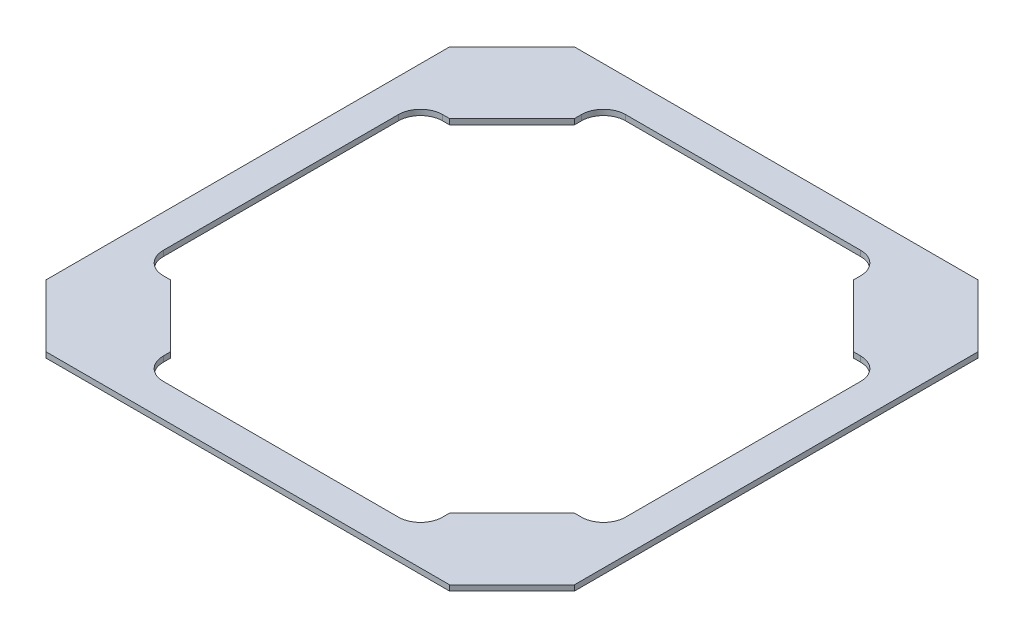
ISO-10303-21;
HEADER;
FILE_DESCRIPTION(('STEP AP214'),'2;1');
FILE_NAME('part.step','',(''),(''),'','','');
FILE_SCHEMA(('AUTOMOTIVE_DESIGN { 1 0 10303 214 1 1 1 1 }'));
ENDSEC;
DATA;
#1=APPLICATION_CONTEXT('core data for automotive mechanical design processes');
#2=APPLICATION_PROTOCOL_DEFINITION('international standard','automotive_design',2000,#1);
#3=PRODUCT_CONTEXT('',#1,'mechanical');
#4=PRODUCT('Part','Part','',(#3));
#5=PRODUCT_RELATED_PRODUCT_CATEGORY('part','',(#4));
#6=PRODUCT_DEFINITION_FORMATION('','',#4);
#7=PRODUCT_DEFINITION_CONTEXT('part definition',#1,'design');
#8=PRODUCT_DEFINITION('design','',#6,#7);
#9=PRODUCT_DEFINITION_SHAPE('','',#8);
#10=(LENGTH_UNIT() NAMED_UNIT(*) SI_UNIT(.MILLI.,.METRE.));
#11=(NAMED_UNIT(*) PLANE_ANGLE_UNIT() SI_UNIT($,.RADIAN.));
#12=(NAMED_UNIT(*) SI_UNIT($,.STERADIAN.) SOLID_ANGLE_UNIT());
#13=UNCERTAINTY_MEASURE_WITH_UNIT(LENGTH_MEASURE(1.E-05),#10,'distance_accuracy_value','');
#14=(GEOMETRIC_REPRESENTATION_CONTEXT(3) GLOBAL_UNCERTAINTY_ASSIGNED_CONTEXT((#13)) GLOBAL_UNIT_ASSIGNED_CONTEXT((#10,
#11,#12)) REPRESENTATION_CONTEXT('',''));
#15=CARTESIAN_POINT('',(0.,0.,0.));
#16=DIRECTION('',(0.,0.,1.));
#17=DIRECTION('',(1.,0.,0.));
#18=AXIS2_PLACEMENT_3D('',#15,#16,#17);
#19=CARTESIAN_POINT('',(0.,3.175,0.));
#20=DIRECTION('',(0.,-1.,0.));
#21=DIRECTION('',(0.,0.,-1.));
#22=AXIS2_PLACEMENT_3D('',#19,#20,#21);
#23=PLANE('',#22);
#24=DIRECTION('',(0.707106781186546,0.,0.707106781186549));
#25=VECTOR('',#24,1.);
#26=CARTESIAN_POINT('',(-152.4,3.175,116.478975515723));
#27=LINE('',#26,#25);
#28=CARTESIAN_POINT('',(-152.4,3.175,116.478975515723));
#29=VERTEX_POINT('',#28);
#30=CARTESIAN_POINT('',(-116.478975515723,3.175,152.4));
#31=VERTEX_POINT('',#30);
#32=EDGE_CURVE('E419',#29,#31,#27,.T.);
#33=ORIENTED_EDGE('',*,*,#32,.T.);
#34=DIRECTION('',(1.,0.,0.));
#35=VECTOR('',#34,1.);
#36=CARTESIAN_POINT('',(-116.478975515723,3.175,152.4));
#37=LINE('',#36,#35);
#38=CARTESIAN_POINT('',(116.478975515723,3.175,152.4));
#39=VERTEX_POINT('',#38);
#40=EDGE_CURVE('E422',#31,#39,#37,.T.);
#41=ORIENTED_EDGE('',*,*,#40,.T.);
#42=DIRECTION('',(0.707106781186546,0.,-0.707106781186549));
#43=VECTOR('',#42,1.);
#44=CARTESIAN_POINT('',(152.4,3.175,116.478975515723));
#45=LINE('',#44,#43);
#46=CARTESIAN_POINT('',(152.4,3.175,116.478975515723));
#47=VERTEX_POINT('',#46);
#48=EDGE_CURVE('E425',#39,#47,#45,.T.);
#49=ORIENTED_EDGE('',*,*,#48,.T.);
#50=DIRECTION('',(0.,0.,-1.));
#51=VECTOR('',#50,1.);
#52=CARTESIAN_POINT('',(152.4,3.175,-116.478975515723));
#53=LINE('',#52,#51);
#54=CARTESIAN_POINT('',(152.4,3.175,-116.478975515723));
#55=VERTEX_POINT('',#54);
#56=EDGE_CURVE('E427',#47,#55,#53,.T.);
#57=ORIENTED_EDGE('',*,*,#56,.T.);
#58=DIRECTION('',(-0.707106781186547,0.,-0.707106781186548));
#59=VECTOR('',#58,1.);
#60=CARTESIAN_POINT('',(152.4,3.175,-116.478975515723));
#61=LINE('',#60,#59);
#62=CARTESIAN_POINT('',(116.478975515723,3.175,-152.4));
#63=VERTEX_POINT('',#62);
#64=EDGE_CURVE('E429',#55,#63,#61,.T.);
#65=ORIENTED_EDGE('',*,*,#64,.T.);
#66=DIRECTION('',(-1.,0.,0.));
#67=VECTOR('',#66,1.);
#68=CARTESIAN_POINT('',(-116.478975515723,3.175,-152.4));
#69=LINE('',#68,#67);
#70=CARTESIAN_POINT('',(-116.478975515723,3.175,-152.4));
#71=VERTEX_POINT('',#70);
#72=EDGE_CURVE('E431',#63,#71,#69,.T.);
#73=ORIENTED_EDGE('',*,*,#72,.T.);
#74=DIRECTION('',(-0.707106781186546,0.,0.707106781186549));
#75=VECTOR('',#74,1.);
#76=CARTESIAN_POINT('',(-152.4,3.175,-116.478975515723));
#77=LINE('',#76,#75);
#78=CARTESIAN_POINT('',(-152.4,3.175,-116.478975515723));
#79=VERTEX_POINT('',#78);
#80=EDGE_CURVE('E433',#71,#79,#77,.T.);
#81=ORIENTED_EDGE('',*,*,#80,.T.);
#82=DIRECTION('',(0.,0.,1.));
#83=VECTOR('',#82,1.);
#84=CARTESIAN_POINT('',(-152.4,3.175,-116.478975515723));
#85=LINE('',#84,#83);
#86=EDGE_CURVE('E435',#79,#29,#85,.T.);
#87=ORIENTED_EDGE('',*,*,#86,.T.);
#88=EDGE_LOOP('',(#33,#41,#49,#57,#65,#73,#81,#87));
#89=FACE_BOUND('',#88,.T.);
#90=DIRECTION('',(-1.,0.,0.));
#91=VECTOR('',#90,1.);
#92=CARTESIAN_POINT('',(-116.478975515723,3.175,-80.5579510314468));
#93=LINE('',#92,#91);
#94=CARTESIAN_POINT('',(-116.478975515723,3.175,-80.5579510314468));
#95=VERTEX_POINT('',#94);
#96=CARTESIAN_POINT('',(-120.65,3.175,-80.5579510314468));
#97=VERTEX_POINT('',#96);
#98=EDGE_CURVE('E242',#95,#97,#93,.T.);
#99=ORIENTED_EDGE('',*,*,#98,.F.);
#100=DIRECTION('',(-0.707106781186547,0.,0.707106781186548));
#101=VECTOR('',#100,1.);
#102=CARTESIAN_POINT('',(-116.478975515723,3.175,-80.5579510314468));
#103=LINE('',#102,#101);
#104=CARTESIAN_POINT('',(-80.5579510314468,3.175,-116.478975515723));
#105=VERTEX_POINT('',#104);
#106=EDGE_CURVE('E307',#105,#95,#103,.T.);
#107=ORIENTED_EDGE('',*,*,#106,.F.);
#108=DIRECTION('',(0.,0.,1.));
#109=VECTOR('',#108,1.);
#110=CARTESIAN_POINT('',(-80.5579510314468,3.175,-116.478975515723));
#111=LINE('',#110,#109);
#112=CARTESIAN_POINT('',(-80.5579510314468,3.175,-120.65));
#113=VERTEX_POINT('',#112);
#114=EDGE_CURVE('E305',#113,#105,#111,.T.);
#115=ORIENTED_EDGE('',*,*,#114,.F.);
#116=CARTESIAN_POINT('',(-67.8579510314468,3.175,-120.65));
#117=DIRECTION('',(0.,1.,0.));
#118=DIRECTION('',(0.,0.,-1.));
#119=AXIS2_PLACEMENT_3D('',#116,#117,#118);
#120=CIRCLE('',#119,12.7);
#121=CARTESIAN_POINT('',(-67.8579510314468,3.175,-133.35));
#122=VERTEX_POINT('',#121);
#123=EDGE_CURVE('E303',#122,#113,#120,.T.);
#124=ORIENTED_EDGE('',*,*,#123,.F.);
#125=DIRECTION('',(-1.,0.,0.));
#126=VECTOR('',#125,1.);
#127=CARTESIAN_POINT('',(-67.8579510314467,3.175,-133.35));
#128=LINE('',#127,#126);
#129=CARTESIAN_POINT('',(67.8579510314467,3.175,-133.35));
#130=VERTEX_POINT('',#129);
#131=EDGE_CURVE('E301',#130,#122,#128,.T.);
#132=ORIENTED_EDGE('',*,*,#131,.F.);
#133=CARTESIAN_POINT('',(67.8579510314468,3.175,-120.65));
#134=DIRECTION('',(0.,1.,0.));
#135=DIRECTION('',(0.,0.,1.));
#136=AXIS2_PLACEMENT_3D('',#133,#134,#135);
#137=CIRCLE('',#136,12.7);
#138=CARTESIAN_POINT('',(80.5579510314468,3.175,-120.65));
#139=VERTEX_POINT('',#138);
#140=EDGE_CURVE('E299',#139,#130,#137,.T.);
#141=ORIENTED_EDGE('',*,*,#140,.F.);
#142=DIRECTION('',(0.,0.,-1.));
#143=VECTOR('',#142,1.);
#144=CARTESIAN_POINT('',(80.5579510314468,3.175,-116.478975515723));
#145=LINE('',#144,#143);
#146=CARTESIAN_POINT('',(80.5579510314468,3.175,-116.478975515723));
#147=VERTEX_POINT('',#146);
#148=EDGE_CURVE('E297',#147,#139,#145,.T.);
#149=ORIENTED_EDGE('',*,*,#148,.F.);
#150=DIRECTION('',(-0.707106781186547,0.,-0.707106781186548));
#151=VECTOR('',#150,1.);
#152=CARTESIAN_POINT('',(116.478975515723,3.175,-80.5579510314467));
#153=LINE('',#152,#151);
#154=CARTESIAN_POINT('',(116.478975515723,3.175,-80.5579510314467));
#155=VERTEX_POINT('',#154);
#156=EDGE_CURVE('E295',#155,#147,#153,.T.);
#157=ORIENTED_EDGE('',*,*,#156,.F.);
#158=DIRECTION('',(-1.,0.,0.));
#159=VECTOR('',#158,1.);
#160=CARTESIAN_POINT('',(116.478975515723,3.175,-80.5579510314467));
#161=LINE('',#160,#159);
#162=CARTESIAN_POINT('',(120.65,3.175,-80.5579510314467));
#163=VERTEX_POINT('',#162);
#164=EDGE_CURVE('E293',#163,#155,#161,.T.);
#165=ORIENTED_EDGE('',*,*,#164,.F.);
#166=CARTESIAN_POINT('',(120.65,3.175,-67.8579510314467));
#167=DIRECTION('',(0.,1.,0.));
#168=DIRECTION('',(0.,0.,-1.));
#169=AXIS2_PLACEMENT_3D('',#166,#167,#168);
#170=CIRCLE('',#169,12.7);
#171=CARTESIAN_POINT('',(133.35,3.175,-67.8579510314466));
#172=VERTEX_POINT('',#171);
#173=EDGE_CURVE('E291',#172,#163,#170,.T.);
#174=ORIENTED_EDGE('',*,*,#173,.F.);
#175=DIRECTION('',(0.,0.,-1.));
#176=VECTOR('',#175,1.);
#177=CARTESIAN_POINT('',(133.35,3.175,-67.8579510314466));
#178=LINE('',#177,#176);
#179=CARTESIAN_POINT('',(133.35,3.175,67.8579510314466));
#180=VERTEX_POINT('',#179);
#181=EDGE_CURVE('E289',#180,#172,#178,.T.);
#182=ORIENTED_EDGE('',*,*,#181,.F.);
#183=CARTESIAN_POINT('',(120.65,3.175,67.8579510314467));
#184=DIRECTION('',(0.,1.,0.));
#185=DIRECTION('',(0.,0.,1.));
#186=AXIS2_PLACEMENT_3D('',#183,#184,#185);
#187=CIRCLE('',#186,12.7);
#188=CARTESIAN_POINT('',(120.65,3.175,80.5579510314467));
#189=VERTEX_POINT('',#188);
#190=EDGE_CURVE('E287',#189,#180,#187,.T.);
#191=ORIENTED_EDGE('',*,*,#190,.F.);
#192=DIRECTION('',(1.,0.,0.));
#193=VECTOR('',#192,1.);
#194=CARTESIAN_POINT('',(116.478975515723,3.175,80.5579510314467));
#195=LINE('',#194,#193);
#196=CARTESIAN_POINT('',(116.478975515723,3.175,80.5579510314467));
#197=VERTEX_POINT('',#196);
#198=EDGE_CURVE('E285',#197,#189,#195,.T.);
#199=ORIENTED_EDGE('',*,*,#198,.F.);
#200=DIRECTION('',(0.707106781186547,0.,-0.707106781186548));
#201=VECTOR('',#200,1.);
#202=CARTESIAN_POINT('',(116.478975515723,3.175,80.5579510314467));
#203=LINE('',#202,#201);
#204=CARTESIAN_POINT('',(80.5579510314468,3.175,116.478975515723));
#205=VERTEX_POINT('',#204);
#206=EDGE_CURVE('E283',#205,#197,#203,.T.);
#207=ORIENTED_EDGE('',*,*,#206,.F.);
#208=DIRECTION('',(0.,0.,-1.));
#209=VECTOR('',#208,1.);
#210=CARTESIAN_POINT('',(80.5579510314468,3.175,116.478975515723));
#211=LINE('',#210,#209);
#212=CARTESIAN_POINT('',(80.5579510314468,3.175,120.65));
#213=VERTEX_POINT('',#212);
#214=EDGE_CURVE('E281',#213,#205,#211,.T.);
#215=ORIENTED_EDGE('',*,*,#214,.F.);
#216=CARTESIAN_POINT('',(67.8579510314468,3.175,120.65));
#217=DIRECTION('',(0.,1.,0.));
#218=DIRECTION('',(0.,0.,-1.));
#219=AXIS2_PLACEMENT_3D('',#216,#217,#218);
#220=CIRCLE('',#219,12.7);
#221=CARTESIAN_POINT('',(67.8579510314467,3.175,133.35));
#222=VERTEX_POINT('',#221);
#223=EDGE_CURVE('E279',#222,#213,#220,.T.);
#224=ORIENTED_EDGE('',*,*,#223,.F.);
#225=DIRECTION('',(1.,0.,0.));
#226=VECTOR('',#225,1.);
#227=CARTESIAN_POINT('',(-67.8579510314467,3.175,133.35));
#228=LINE('',#227,#226);
#229=CARTESIAN_POINT('',(-67.8579510314467,3.175,133.35));
#230=VERTEX_POINT('',#229);
#231=EDGE_CURVE('E277',#230,#222,#228,.T.);
#232=ORIENTED_EDGE('',*,*,#231,.F.);
#233=CARTESIAN_POINT('',(-67.8579510314468,3.175,120.65));
#234=DIRECTION('',(0.,1.,0.));
#235=DIRECTION('',(0.,0.,1.));
#236=AXIS2_PLACEMENT_3D('',#233,#234,#235);
#237=CIRCLE('',#236,12.7);
#238=CARTESIAN_POINT('',(-80.5579510314468,3.175,120.65));
#239=VERTEX_POINT('',#238);
#240=EDGE_CURVE('E275',#239,#230,#237,.T.);
#241=ORIENTED_EDGE('',*,*,#240,.F.);
#242=DIRECTION('',(0.,0.,1.));
#243=VECTOR('',#242,1.);
#244=CARTESIAN_POINT('',(-80.5579510314468,3.175,116.478975515723));
#245=LINE('',#244,#243);
#246=CARTESIAN_POINT('',(-80.5579510314468,3.175,116.478975515723));
#247=VERTEX_POINT('',#246);
#248=EDGE_CURVE('E273',#247,#239,#245,.T.);
#249=ORIENTED_EDGE('',*,*,#248,.F.);
#250=DIRECTION('',(0.707106781186547,0.,0.707106781186548));
#251=VECTOR('',#250,1.);
#252=CARTESIAN_POINT('',(-116.478975515723,3.175,80.5579510314468));
#253=LINE('',#252,#251);
#254=CARTESIAN_POINT('',(-116.478975515723,3.175,80.5579510314468));
#255=VERTEX_POINT('',#254);
#256=EDGE_CURVE('E271',#255,#247,#253,.T.);
#257=ORIENTED_EDGE('',*,*,#256,.F.);
#258=DIRECTION('',(1.,0.,0.));
#259=VECTOR('',#258,1.);
#260=CARTESIAN_POINT('',(-116.478975515723,3.175,80.5579510314468));
#261=LINE('',#260,#259);
#262=CARTESIAN_POINT('',(-120.65,3.175,80.5579510314468));
#263=VERTEX_POINT('',#262);
#264=EDGE_CURVE('E269',#263,#255,#261,.T.);
#265=ORIENTED_EDGE('',*,*,#264,.F.);
#266=CARTESIAN_POINT('',(-120.65,3.175,67.8579510314468));
#267=DIRECTION('',(0.,1.,0.));
#268=DIRECTION('',(0.,0.,-1.));
#269=AXIS2_PLACEMENT_3D('',#266,#267,#268);
#270=CIRCLE('',#269,12.7);
#271=CARTESIAN_POINT('',(-133.35,3.175,67.8579510314467));
#272=VERTEX_POINT('',#271);
#273=EDGE_CURVE('E265',#272,#263,#270,.T.);
#274=ORIENTED_EDGE('',*,*,#273,.F.);
#275=DIRECTION('',(0.,0.,1.));
#276=VECTOR('',#275,1.);
#277=CARTESIAN_POINT('',(-133.35,3.175,-67.8579510314467));
#278=LINE('',#277,#276);
#279=CARTESIAN_POINT('',(-133.35,3.175,-67.8579510314467));
#280=VERTEX_POINT('',#279);
#281=EDGE_CURVE('E263',#280,#272,#278,.T.);
#282=ORIENTED_EDGE('',*,*,#281,.F.);
#283=CARTESIAN_POINT('',(-120.65,3.175,-67.8579510314468));
#284=DIRECTION('',(0.,1.,0.));
#285=DIRECTION('',(0.,0.,1.));
#286=AXIS2_PLACEMENT_3D('',#283,#284,#285);
#287=CIRCLE('',#286,12.7);
#288=EDGE_CURVE('E250',#97,#280,#287,.T.);
#289=ORIENTED_EDGE('',*,*,#288,.F.);
#290=EDGE_LOOP('',(#99,#107,#115,#124,#132,#141,#149,#157,#165,#174,#182,#191,#199,#207,#215,
#224,#232,#241,#249,#257,#265,#274,#282,#289));
#291=FACE_BOUND('',#290,.T.);
#292=ADVANCED_FACE('F33',(#89,#291),#23,.F.);
#293=CARTESIAN_POINT('',(0.,0.,0.));
#294=DIRECTION('',(0.,-1.,0.));
#295=DIRECTION('',(0.,0.,-1.));
#296=AXIS2_PLACEMENT_3D('',#293,#294,#295);
#297=PLANE('',#296);
#298=DIRECTION('',(0.707106781186546,0.,0.707106781186549));
#299=VECTOR('',#298,1.);
#300=CARTESIAN_POINT('',(-152.4,0.,116.478975515723));
#301=LINE('',#300,#299);
#302=CARTESIAN_POINT('',(-152.4,0.,116.478975515723));
#303=VERTEX_POINT('',#302);
#304=CARTESIAN_POINT('',(-116.478975515723,0.,152.4));
#305=VERTEX_POINT('',#304);
#306=EDGE_CURVE('E258',#303,#305,#301,.T.);
#307=ORIENTED_EDGE('',*,*,#306,.F.);
#308=DIRECTION('',(0.,0.,1.));
#309=VECTOR('',#308,1.);
#310=CARTESIAN_POINT('',(-152.4,0.,-116.478975515723));
#311=LINE('',#310,#309);
#312=CARTESIAN_POINT('',(-152.4,0.,-116.478975515723));
#313=VERTEX_POINT('',#312);
#314=EDGE_CURVE('E423',#313,#303,#311,.T.);
#315=ORIENTED_EDGE('',*,*,#314,.F.);
#316=DIRECTION('',(-0.707106781186546,0.,0.707106781186549));
#317=VECTOR('',#316,1.);
#318=CARTESIAN_POINT('',(-152.4,0.,-116.478975515723));
#319=LINE('',#318,#317);
#320=CARTESIAN_POINT('',(-116.478975515723,0.,-152.4));
#321=VERTEX_POINT('',#320);
#322=EDGE_CURVE('E450',#321,#313,#319,.T.);
#323=ORIENTED_EDGE('',*,*,#322,.F.);
#324=DIRECTION('',(-1.,0.,0.));
#325=VECTOR('',#324,1.);
#326=CARTESIAN_POINT('',(-116.478975515723,0.,-152.4));
#327=LINE('',#326,#325);
#328=CARTESIAN_POINT('',(116.478975515723,0.,-152.4));
#329=VERTEX_POINT('',#328);
#330=EDGE_CURVE('E448',#329,#321,#327,.T.);
#331=ORIENTED_EDGE('',*,*,#330,.F.);
#332=DIRECTION('',(-0.707106781186547,0.,-0.707106781186548));
#333=VECTOR('',#332,1.);
#334=CARTESIAN_POINT('',(152.4,0.,-116.478975515723));
#335=LINE('',#334,#333);
#336=CARTESIAN_POINT('',(152.4,0.,-116.478975515723));
#337=VERTEX_POINT('',#336);
#338=EDGE_CURVE('E446',#337,#329,#335,.T.);
#339=ORIENTED_EDGE('',*,*,#338,.F.);
#340=DIRECTION('',(0.,0.,-1.));
#341=VECTOR('',#340,1.);
#342=CARTESIAN_POINT('',(152.4,0.,-116.478975515723));
#343=LINE('',#342,#341);
#344=CARTESIAN_POINT('',(152.4,0.,116.478975515723));
#345=VERTEX_POINT('',#344);
#346=EDGE_CURVE('E444',#345,#337,#343,.T.);
#347=ORIENTED_EDGE('',*,*,#346,.F.);
#348=DIRECTION('',(0.707106781186546,0.,-0.707106781186549));
#349=VECTOR('',#348,1.);
#350=CARTESIAN_POINT('',(152.4,0.,116.478975515723));
#351=LINE('',#350,#349);
#352=CARTESIAN_POINT('',(116.478975515723,0.,152.4));
#353=VERTEX_POINT('',#352);
#354=EDGE_CURVE('E442',#353,#345,#351,.T.);
#355=ORIENTED_EDGE('',*,*,#354,.F.);
#356=DIRECTION('',(1.,0.,0.));
#357=VECTOR('',#356,1.);
#358=CARTESIAN_POINT('',(-116.478975515723,0.,152.4));
#359=LINE('',#358,#357);
#360=EDGE_CURVE('E440',#305,#353,#359,.T.);
#361=ORIENTED_EDGE('',*,*,#360,.F.);
#362=EDGE_LOOP('',(#307,#315,#323,#331,#339,#347,#355,#361));
#363=FACE_BOUND('',#362,.T.);
#364=DIRECTION('',(-0.707106781186547,0.,0.707106781186548));
#365=VECTOR('',#364,1.);
#366=CARTESIAN_POINT('',(-116.478975515723,0.,-80.5579510314468));
#367=LINE('',#366,#365);
#368=CARTESIAN_POINT('',(-80.5579510314468,0.,-116.478975515723));
#369=VERTEX_POINT('',#368);
#370=CARTESIAN_POINT('',(-116.478975515723,0.,-80.5579510314468));
#371=VERTEX_POINT('',#370);
#372=EDGE_CURVE('E251',#369,#371,#367,.T.);
#373=ORIENTED_EDGE('',*,*,#372,.T.);
#374=DIRECTION('',(-1.,0.,0.));
#375=VECTOR('',#374,1.);
#376=CARTESIAN_POINT('',(-116.478975515723,0.,-80.5579510314468));
#377=LINE('',#376,#375);
#378=CARTESIAN_POINT('',(-120.65,0.,-80.5579510314468));
#379=VERTEX_POINT('',#378);
#380=EDGE_CURVE('E56',#371,#379,#377,.T.);
#381=ORIENTED_EDGE('',*,*,#380,.T.);
#382=CARTESIAN_POINT('',(-120.65,0.,-67.8579510314468));
#383=DIRECTION('',(0.,1.,0.));
#384=DIRECTION('',(0.,0.,1.));
#385=AXIS2_PLACEMENT_3D('',#382,#383,#384);
#386=CIRCLE('',#385,12.7);
#387=CARTESIAN_POINT('',(-133.35,0.,-67.8579510314467));
#388=VERTEX_POINT('',#387);
#389=EDGE_CURVE('E257',#379,#388,#386,.T.);
#390=ORIENTED_EDGE('',*,*,#389,.T.);
#391=DIRECTION('',(0.,0.,1.));
#392=VECTOR('',#391,1.);
#393=CARTESIAN_POINT('',(-133.35,0.,-67.8579510314467));
#394=LINE('',#393,#392);
#395=CARTESIAN_POINT('',(-133.35,0.,67.8579510314467));
#396=VERTEX_POINT('',#395);
#397=EDGE_CURVE('E311',#388,#396,#394,.T.);
#398=ORIENTED_EDGE('',*,*,#397,.T.);
#399=CARTESIAN_POINT('',(-120.65,0.,67.8579510314468));
#400=DIRECTION('',(0.,1.,0.));
#401=DIRECTION('',(0.,0.,-1.));
#402=AXIS2_PLACEMENT_3D('',#399,#400,#401);
#403=CIRCLE('',#402,12.7);
#404=CARTESIAN_POINT('',(-120.65,0.,80.5579510314468));
#405=VERTEX_POINT('',#404);
#406=EDGE_CURVE('E314',#396,#405,#403,.T.);
#407=ORIENTED_EDGE('',*,*,#406,.T.);
#408=DIRECTION('',(1.,0.,0.));
#409=VECTOR('',#408,1.);
#410=CARTESIAN_POINT('',(-116.478975515723,0.,80.5579510314468));
#411=LINE('',#410,#409);
#412=CARTESIAN_POINT('',(-116.478975515723,0.,80.5579510314468));
#413=VERTEX_POINT('',#412);
#414=EDGE_CURVE('E317',#405,#413,#411,.T.);
#415=ORIENTED_EDGE('',*,*,#414,.T.);
#416=DIRECTION('',(0.707106781186547,0.,0.707106781186548));
#417=VECTOR('',#416,1.);
#418=CARTESIAN_POINT('',(-116.478975515723,0.,80.5579510314468));
#419=LINE('',#418,#417);
#420=CARTESIAN_POINT('',(-80.5579510314468,0.,116.478975515723));
#421=VERTEX_POINT('',#420);
#422=EDGE_CURVE('E320',#413,#421,#419,.T.);
#423=ORIENTED_EDGE('',*,*,#422,.T.);
#424=DIRECTION('',(0.,0.,1.));
#425=VECTOR('',#424,1.);
#426=CARTESIAN_POINT('',(-80.5579510314468,0.,116.478975515723));
#427=LINE('',#426,#425);
#428=CARTESIAN_POINT('',(-80.5579510314468,0.,120.65));
#429=VERTEX_POINT('',#428);
#430=EDGE_CURVE('E323',#421,#429,#427,.T.);
#431=ORIENTED_EDGE('',*,*,#430,.T.);
#432=CARTESIAN_POINT('',(-67.8579510314468,0.,120.65));
#433=DIRECTION('',(0.,1.,0.));
#434=DIRECTION('',(0.,0.,1.));
#435=AXIS2_PLACEMENT_3D('',#432,#433,#434);
#436=CIRCLE('',#435,12.7);
#437=CARTESIAN_POINT('',(-67.8579510314467,0.,133.35));
#438=VERTEX_POINT('',#437);
#439=EDGE_CURVE('E326',#429,#438,#436,.T.);
#440=ORIENTED_EDGE('',*,*,#439,.T.);
#441=DIRECTION('',(1.,0.,0.));
#442=VECTOR('',#441,1.);
#443=CARTESIAN_POINT('',(-67.8579510314467,0.,133.35));
#444=LINE('',#443,#442);
#445=CARTESIAN_POINT('',(67.8579510314467,0.,133.35));
#446=VERTEX_POINT('',#445);
#447=EDGE_CURVE('E329',#438,#446,#444,.T.);
#448=ORIENTED_EDGE('',*,*,#447,.T.);
#449=CARTESIAN_POINT('',(67.8579510314468,0.,120.65));
#450=DIRECTION('',(0.,1.,0.));
#451=DIRECTION('',(0.,0.,-1.));
#452=AXIS2_PLACEMENT_3D('',#449,#450,#451);
#453=CIRCLE('',#452,12.7);
#454=CARTESIAN_POINT('',(80.5579510314468,0.,120.65));
#455=VERTEX_POINT('',#454);
#456=EDGE_CURVE('E332',#446,#455,#453,.T.);
#457=ORIENTED_EDGE('',*,*,#456,.T.);
#458=DIRECTION('',(0.,0.,-1.));
#459=VECTOR('',#458,1.);
#460=CARTESIAN_POINT('',(80.5579510314468,0.,116.478975515723));
#461=LINE('',#460,#459);
#462=CARTESIAN_POINT('',(80.5579510314468,0.,116.478975515723));
#463=VERTEX_POINT('',#462);
#464=EDGE_CURVE('E335',#455,#463,#461,.T.);
#465=ORIENTED_EDGE('',*,*,#464,.T.);
#466=DIRECTION('',(0.707106781186547,0.,-0.707106781186548));
#467=VECTOR('',#466,1.);
#468=CARTESIAN_POINT('',(116.478975515723,0.,80.5579510314467));
#469=LINE('',#468,#467);
#470=CARTESIAN_POINT('',(116.478975515723,0.,80.5579510314467));
#471=VERTEX_POINT('',#470);
#472=EDGE_CURVE('E338',#463,#471,#469,.T.);
#473=ORIENTED_EDGE('',*,*,#472,.T.);
#474=DIRECTION('',(1.,0.,0.));
#475=VECTOR('',#474,1.);
#476=CARTESIAN_POINT('',(116.478975515723,0.,80.5579510314467));
#477=LINE('',#476,#475);
#478=CARTESIAN_POINT('',(120.65,0.,80.5579510314467));
#479=VERTEX_POINT('',#478);
#480=EDGE_CURVE('E341',#471,#479,#477,.T.);
#481=ORIENTED_EDGE('',*,*,#480,.T.);
#482=CARTESIAN_POINT('',(120.65,0.,67.8579510314467));
#483=DIRECTION('',(0.,1.,0.));
#484=DIRECTION('',(0.,0.,1.));
#485=AXIS2_PLACEMENT_3D('',#482,#483,#484);
#486=CIRCLE('',#485,12.7);
#487=CARTESIAN_POINT('',(133.35,0.,67.8579510314466));
#488=VERTEX_POINT('',#487);
#489=EDGE_CURVE('E344',#479,#488,#486,.T.);
#490=ORIENTED_EDGE('',*,*,#489,.T.);
#491=DIRECTION('',(0.,0.,-1.));
#492=VECTOR('',#491,1.);
#493=CARTESIAN_POINT('',(133.35,0.,-67.8579510314466));
#494=LINE('',#493,#492);
#495=CARTESIAN_POINT('',(133.35,0.,-67.8579510314466));
#496=VERTEX_POINT('',#495);
#497=EDGE_CURVE('E347',#488,#496,#494,.T.);
#498=ORIENTED_EDGE('',*,*,#497,.T.);
#499=CARTESIAN_POINT('',(120.65,0.,-67.8579510314467));
#500=DIRECTION('',(0.,1.,0.));
#501=DIRECTION('',(0.,0.,-1.));
#502=AXIS2_PLACEMENT_3D('',#499,#500,#501);
#503=CIRCLE('',#502,12.7);
#504=CARTESIAN_POINT('',(120.65,0.,-80.5579510314467));
#505=VERTEX_POINT('',#504);
#506=EDGE_CURVE('E350',#496,#505,#503,.T.);
#507=ORIENTED_EDGE('',*,*,#506,.T.);
#508=DIRECTION('',(-1.,0.,0.));
#509=VECTOR('',#508,1.);
#510=CARTESIAN_POINT('',(116.478975515723,0.,-80.5579510314467));
#511=LINE('',#510,#509);
#512=CARTESIAN_POINT('',(116.478975515723,0.,-80.5579510314467));
#513=VERTEX_POINT('',#512);
#514=EDGE_CURVE('E353',#505,#513,#511,.T.);
#515=ORIENTED_EDGE('',*,*,#514,.T.);
#516=DIRECTION('',(-0.707106781186547,0.,-0.707106781186548));
#517=VECTOR('',#516,1.);
#518=CARTESIAN_POINT('',(116.478975515723,0.,-80.5579510314467));
#519=LINE('',#518,#517);
#520=CARTESIAN_POINT('',(80.5579510314468,0.,-116.478975515723));
#521=VERTEX_POINT('',#520);
#522=EDGE_CURVE('E356',#513,#521,#519,.T.);
#523=ORIENTED_EDGE('',*,*,#522,.T.);
#524=DIRECTION('',(0.,0.,-1.));
#525=VECTOR('',#524,1.);
#526=CARTESIAN_POINT('',(80.5579510314468,0.,-116.478975515723));
#527=LINE('',#526,#525);
#528=CARTESIAN_POINT('',(80.5579510314468,0.,-120.65));
#529=VERTEX_POINT('',#528);
#530=EDGE_CURVE('E359',#521,#529,#527,.T.);
#531=ORIENTED_EDGE('',*,*,#530,.T.);
#532=CARTESIAN_POINT('',(67.8579510314468,0.,-120.65));
#533=DIRECTION('',(0.,1.,0.));
#534=DIRECTION('',(0.,0.,1.));
#535=AXIS2_PLACEMENT_3D('',#532,#533,#534);
#536=CIRCLE('',#535,12.7);
#537=CARTESIAN_POINT('',(67.8579510314467,0.,-133.35));
#538=VERTEX_POINT('',#537);
#539=EDGE_CURVE('E362',#529,#538,#536,.T.);
#540=ORIENTED_EDGE('',*,*,#539,.T.);
#541=DIRECTION('',(-1.,0.,0.));
#542=VECTOR('',#541,1.);
#543=CARTESIAN_POINT('',(-67.8579510314467,0.,-133.35));
#544=LINE('',#543,#542);
#545=CARTESIAN_POINT('',(-67.8579510314468,0.,-133.35));
#546=VERTEX_POINT('',#545);
#547=EDGE_CURVE('E365',#538,#546,#544,.T.);
#548=ORIENTED_EDGE('',*,*,#547,.T.);
#549=CARTESIAN_POINT('',(-67.8579510314468,0.,-120.65));
#550=DIRECTION('',(0.,1.,0.));
#551=DIRECTION('',(0.,0.,-1.));
#552=AXIS2_PLACEMENT_3D('',#549,#550,#551);
#553=CIRCLE('',#552,12.7);
#554=CARTESIAN_POINT('',(-80.5579510314468,0.,-120.65));
#555=VERTEX_POINT('',#554);
#556=EDGE_CURVE('E368',#546,#555,#553,.T.);
#557=ORIENTED_EDGE('',*,*,#556,.T.);
#558=DIRECTION('',(0.,0.,1.));
#559=VECTOR('',#558,1.);
#560=CARTESIAN_POINT('',(-80.5579510314468,0.,-116.478975515723));
#561=LINE('',#560,#559);
#562=EDGE_CURVE('E371',#555,#369,#561,.T.);
#563=ORIENTED_EDGE('',*,*,#562,.T.);
#564=EDGE_LOOP('',(#373,#381,#390,#398,#407,#415,#423,#431,#440,#448,#457,#465,#473,#481,#490,
#498,#507,#515,#523,#531,#540,#548,#557,#563));
#565=FACE_BOUND('',#564,.T.);
#566=ADVANCED_FACE('F480',(#363,#565),#297,.T.);
#567=CARTESIAN_POINT('',(-152.4,3.175,116.478975515723));
#568=DIRECTION('',(0.707106781186549,0.,-0.707106781186546));
#569=DIRECTION('',(-0.707106781186546,0.,-0.707106781186549));
#570=AXIS2_PLACEMENT_3D('',#567,#568,#569);
#571=PLANE('',#570);
#572=ORIENTED_EDGE('',*,*,#306,.T.);
#573=DIRECTION('',(0.,-1.,0.));
#574=VECTOR('',#573,1.);
#575=CARTESIAN_POINT('',(-116.478975515723,3.175,152.4));
#576=LINE('',#575,#574);
#577=EDGE_CURVE('E11',#31,#305,#576,.T.);
#578=ORIENTED_EDGE('',*,*,#577,.F.);
#579=ORIENTED_EDGE('',*,*,#32,.F.);
#580=DIRECTION('',(0.,-1.,0.));
#581=VECTOR('',#580,1.);
#582=CARTESIAN_POINT('',(-152.4,3.175,116.478975515723));
#583=LINE('',#582,#581);
#584=EDGE_CURVE('E437',#29,#303,#583,.T.);
#585=ORIENTED_EDGE('',*,*,#584,.T.);
#586=EDGE_LOOP('',(#572,#578,#579,#585));
#587=FACE_BOUND('',#586,.T.);
#588=ADVANCED_FACE('F35',(#587),#571,.F.);
#589=CARTESIAN_POINT('',(-116.478975515723,3.175,152.4));
#590=DIRECTION('',(0.,0.,-1.));
#591=DIRECTION('',(-1.,0.,0.));
#592=AXIS2_PLACEMENT_3D('',#589,#590,#591);
#593=PLANE('',#592);
#594=ORIENTED_EDGE('',*,*,#360,.T.);
#595=DIRECTION('',(0.,-1.,0.));
#596=VECTOR('',#595,1.);
#597=CARTESIAN_POINT('',(116.478975515723,3.175,152.4));
#598=LINE('',#597,#596);
#599=EDGE_CURVE('E41',#39,#353,#598,.T.);
#600=ORIENTED_EDGE('',*,*,#599,.F.);
#601=ORIENTED_EDGE('',*,*,#40,.F.);
#602=ORIENTED_EDGE('',*,*,#577,.T.);
#603=EDGE_LOOP('',(#594,#600,#601,#602));
#604=FACE_BOUND('',#603,.T.);
#605=ADVANCED_FACE('F497',(#604),#593,.F.);
#606=CARTESIAN_POINT('',(152.4,3.175,116.478975515723));
#607=DIRECTION('',(-0.707106781186549,0.,-0.707106781186546));
#608=DIRECTION('',(-0.707106781186546,0.,0.707106781186549));
#609=AXIS2_PLACEMENT_3D('',#606,#607,#608);
#610=PLANE('',#609);
#611=ORIENTED_EDGE('',*,*,#354,.T.);
#612=DIRECTION('',(0.,-1.,0.));
#613=VECTOR('',#612,1.);
#614=CARTESIAN_POINT('',(152.4,3.175,116.478975515723));
#615=LINE('',#614,#613);
#616=EDGE_CURVE('E467',#47,#345,#615,.T.);
#617=ORIENTED_EDGE('',*,*,#616,.F.);
#618=ORIENTED_EDGE('',*,*,#48,.F.);
#619=ORIENTED_EDGE('',*,*,#599,.T.);
#620=EDGE_LOOP('',(#611,#617,#618,#619));
#621=FACE_BOUND('',#620,.T.);
#622=ADVANCED_FACE('F474',(#621),#610,.F.);
#623=CARTESIAN_POINT('',(152.4,3.175,-116.478975515723));
#624=DIRECTION('',(-1.,0.,0.));
#625=DIRECTION('',(0.,0.,1.));
#626=AXIS2_PLACEMENT_3D('',#623,#624,#625);
#627=PLANE('',#626);
#628=ORIENTED_EDGE('',*,*,#346,.T.);
#629=DIRECTION('',(0.,-1.,0.));
#630=VECTOR('',#629,1.);
#631=CARTESIAN_POINT('',(152.4,3.175,-116.478975515723));
#632=LINE('',#631,#630);
#633=EDGE_CURVE('E464',#55,#337,#632,.T.);
#634=ORIENTED_EDGE('',*,*,#633,.F.);
#635=ORIENTED_EDGE('',*,*,#56,.F.);
#636=ORIENTED_EDGE('',*,*,#616,.T.);
#637=EDGE_LOOP('',(#628,#634,#635,#636));
#638=FACE_BOUND('',#637,.T.);
#639=ADVANCED_FACE('F486',(#638),#627,.F.);
#640=CARTESIAN_POINT('',(152.4,3.175,-116.478975515723));
#641=DIRECTION('',(-0.707106781186548,0.,0.707106781186547));
#642=DIRECTION('',(0.707106781186547,0.,0.707106781186548));
#643=AXIS2_PLACEMENT_3D('',#640,#641,#642);
#644=PLANE('',#643);
#645=ORIENTED_EDGE('',*,*,#338,.T.);
#646=DIRECTION('',(0.,-1.,0.));
#647=VECTOR('',#646,1.);
#648=CARTESIAN_POINT('',(116.478975515723,3.175,-152.4));
#649=LINE('',#648,#647);
#650=EDGE_CURVE('E461',#63,#329,#649,.T.);
#651=ORIENTED_EDGE('',*,*,#650,.F.);
#652=ORIENTED_EDGE('',*,*,#64,.F.);
#653=ORIENTED_EDGE('',*,*,#633,.T.);
#654=EDGE_LOOP('',(#645,#651,#652,#653));
#655=FACE_BOUND('',#654,.T.);
#656=ADVANCED_FACE('F490',(#655),#644,.F.);
#657=CARTESIAN_POINT('',(-116.478975515723,3.175,-152.4));
#658=DIRECTION('',(0.,0.,1.));
#659=DIRECTION('',(1.,0.,0.));
#660=AXIS2_PLACEMENT_3D('',#657,#658,#659);
#661=PLANE('',#660);
#662=ORIENTED_EDGE('',*,*,#330,.T.);
#663=DIRECTION('',(0.,-1.,0.));
#664=VECTOR('',#663,1.);
#665=CARTESIAN_POINT('',(-116.478975515723,3.175,-152.4));
#666=LINE('',#665,#664);
#667=EDGE_CURVE('E458',#71,#321,#666,.T.);
#668=ORIENTED_EDGE('',*,*,#667,.F.);
#669=ORIENTED_EDGE('',*,*,#72,.F.);
#670=ORIENTED_EDGE('',*,*,#650,.T.);
#671=EDGE_LOOP('',(#662,#668,#669,#670));
#672=FACE_BOUND('',#671,.T.);
#673=ADVANCED_FACE('F510',(#672),#661,.F.);
#674=CARTESIAN_POINT('',(-152.4,3.175,-116.478975515723));
#675=DIRECTION('',(0.707106781186549,0.,0.707106781186546));
#676=DIRECTION('',(0.707106781186546,0.,-0.707106781186549));
#677=AXIS2_PLACEMENT_3D('',#674,#675,#676);
#678=PLANE('',#677);
#679=ORIENTED_EDGE('',*,*,#322,.T.);
#680=DIRECTION('',(0.,-1.,0.));
#681=VECTOR('',#680,1.);
#682=CARTESIAN_POINT('',(-152.4,3.175,-116.478975515723));
#683=LINE('',#682,#681);
#684=EDGE_CURVE('E455',#79,#313,#683,.T.);
#685=ORIENTED_EDGE('',*,*,#684,.F.);
#686=ORIENTED_EDGE('',*,*,#80,.F.);
#687=ORIENTED_EDGE('',*,*,#667,.T.);
#688=EDGE_LOOP('',(#679,#685,#686,#687));
#689=FACE_BOUND('',#688,.T.);
#690=ADVANCED_FACE('F508',(#689),#678,.F.);
#691=CARTESIAN_POINT('',(-152.4,3.175,-116.478975515723));
#692=DIRECTION('',(1.,0.,0.));
#693=DIRECTION('',(0.,0.,-1.));
#694=AXIS2_PLACEMENT_3D('',#691,#692,#693);
#695=PLANE('',#694);
#696=ORIENTED_EDGE('',*,*,#314,.T.);
#697=ORIENTED_EDGE('',*,*,#584,.F.);
#698=ORIENTED_EDGE('',*,*,#86,.F.);
#699=ORIENTED_EDGE('',*,*,#684,.T.);
#700=EDGE_LOOP('',(#696,#697,#698,#699));
#701=FACE_BOUND('',#700,.T.);
#702=ADVANCED_FACE('F503',(#701),#695,.F.);
#703=CARTESIAN_POINT('',(-116.478975515723,3.175,-80.5579510314468));
#704=DIRECTION('',(0.,0.,1.));
#705=DIRECTION('',(1.,0.,0.));
#706=AXIS2_PLACEMENT_3D('',#703,#704,#705);
#707=PLANE('',#706);
#708=ORIENTED_EDGE('',*,*,#380,.F.);
#709=DIRECTION('',(0.,-1.,0.));
#710=VECTOR('',#709,1.);
#711=CARTESIAN_POINT('',(-116.478975515723,3.175,-80.5579510314468));
#712=LINE('',#711,#710);
#713=EDGE_CURVE('E246',#95,#371,#712,.T.);
#714=ORIENTED_EDGE('',*,*,#713,.F.);
#715=ORIENTED_EDGE('',*,*,#98,.T.);
#716=DIRECTION('',(0.,-1.,0.));
#717=VECTOR('',#716,1.);
#718=CARTESIAN_POINT('',(-120.65,3.175,-80.5579510314468));
#719=LINE('',#718,#717);
#720=EDGE_CURVE('E245',#97,#379,#719,.T.);
#721=ORIENTED_EDGE('',*,*,#720,.T.);
#722=EDGE_LOOP('',(#708,#714,#715,#721));
#723=FACE_BOUND('',#722,.T.);
#724=ADVANCED_FACE('F244',(#723),#707,.T.);
#725=CARTESIAN_POINT('',(-120.65,3.175,-67.8579510314468));
#726=DIRECTION('',(0.,-1.,0.));
#727=DIRECTION('',(0.,0.,-1.));
#728=AXIS2_PLACEMENT_3D('',#725,#726,#727);
#729=CYLINDRICAL_SURFACE('',#728,12.7);
#730=ORIENTED_EDGE('',*,*,#389,.F.);
#731=ORIENTED_EDGE('',*,*,#720,.F.);
#732=ORIENTED_EDGE('',*,*,#288,.T.);
#733=DIRECTION('',(0.,-1.,0.));
#734=VECTOR('',#733,1.);
#735=CARTESIAN_POINT('',(-133.35,3.175,-67.8579510314467));
#736=LINE('',#735,#734);
#737=EDGE_CURVE('E259',#280,#388,#736,.T.);
#738=ORIENTED_EDGE('',*,*,#737,.T.);
#739=EDGE_LOOP('',(#730,#731,#732,#738));
#740=FACE_BOUND('',#739,.T.);
#741=ADVANCED_FACE('F254',(#740),#729,.F.);
#742=CARTESIAN_POINT('',(-133.35,3.175,-67.8579510314467));
#743=DIRECTION('',(1.,0.,0.));
#744=DIRECTION('',(0.,0.,-1.));
#745=AXIS2_PLACEMENT_3D('',#742,#743,#744);
#746=PLANE('',#745);
#747=ORIENTED_EDGE('',*,*,#397,.F.);
#748=ORIENTED_EDGE('',*,*,#737,.F.);
#749=ORIENTED_EDGE('',*,*,#281,.T.);
#750=DIRECTION('',(0.,-1.,0.));
#751=VECTOR('',#750,1.);
#752=CARTESIAN_POINT('',(-133.35,3.175,67.8579510314467));
#753=LINE('',#752,#751);
#754=EDGE_CURVE('E416',#272,#396,#753,.T.);
#755=ORIENTED_EDGE('',*,*,#754,.T.);
#756=EDGE_LOOP('',(#747,#748,#749,#755));
#757=FACE_BOUND('',#756,.T.);
#758=ADVANCED_FACE('F535',(#757),#746,.T.);
#759=CARTESIAN_POINT('',(-120.65,3.175,67.8579510314468));
#760=DIRECTION('',(0.,-1.,0.));
#761=DIRECTION('',(0.,0.,-1.));
#762=AXIS2_PLACEMENT_3D('',#759,#760,#761);
#763=CYLINDRICAL_SURFACE('',#762,12.7);
#764=ORIENTED_EDGE('',*,*,#406,.F.);
#765=ORIENTED_EDGE('',*,*,#754,.F.);
#766=ORIENTED_EDGE('',*,*,#273,.T.);
#767=DIRECTION('',(0.,-1.,0.));
#768=VECTOR('',#767,1.);
#769=CARTESIAN_POINT('',(-120.65,3.175,80.5579510314468));
#770=LINE('',#769,#768);
#771=EDGE_CURVE('E414',#263,#405,#770,.T.);
#772=ORIENTED_EDGE('',*,*,#771,.T.);
#773=EDGE_LOOP('',(#764,#765,#766,#772));
#774=FACE_BOUND('',#773,.T.);
#775=ADVANCED_FACE('F539',(#774),#763,.F.);
#776=CARTESIAN_POINT('',(-116.478975515723,3.175,80.5579510314468));
#777=DIRECTION('',(0.,0.,-1.));
#778=DIRECTION('',(-1.,0.,0.));
#779=AXIS2_PLACEMENT_3D('',#776,#777,#778);
#780=PLANE('',#779);
#781=ORIENTED_EDGE('',*,*,#414,.F.);
#782=ORIENTED_EDGE('',*,*,#771,.F.);
#783=ORIENTED_EDGE('',*,*,#264,.T.);
#784=DIRECTION('',(0.,-1.,0.));
#785=VECTOR('',#784,1.);
#786=CARTESIAN_POINT('',(-116.478975515723,3.175,80.5579510314468));
#787=LINE('',#786,#785);
#788=EDGE_CURVE('E412',#255,#413,#787,.T.);
#789=ORIENTED_EDGE('',*,*,#788,.T.);
#790=EDGE_LOOP('',(#781,#782,#783,#789));
#791=FACE_BOUND('',#790,.T.);
#792=ADVANCED_FACE('F545',(#791),#780,.T.);
#793=CARTESIAN_POINT('',(-116.478975515723,3.175,80.5579510314468));
#794=DIRECTION('',(0.707106781186548,0.,-0.707106781186547));
#795=DIRECTION('',(-0.707106781186547,0.,-0.707106781186548));
#796=AXIS2_PLACEMENT_3D('',#793,#794,#795);
#797=PLANE('',#796);
#798=ORIENTED_EDGE('',*,*,#422,.F.);
#799=ORIENTED_EDGE('',*,*,#788,.F.);
#800=ORIENTED_EDGE('',*,*,#256,.T.);
#801=DIRECTION('',(0.,-1.,0.));
#802=VECTOR('',#801,1.);
#803=CARTESIAN_POINT('',(-80.5579510314468,3.175,116.478975515723));
#804=LINE('',#803,#802);
#805=EDGE_CURVE('E410',#247,#421,#804,.T.);
#806=ORIENTED_EDGE('',*,*,#805,.T.);
#807=EDGE_LOOP('',(#798,#799,#800,#806));
#808=FACE_BOUND('',#807,.T.);
#809=ADVANCED_FACE('F549',(#808),#797,.T.);
#810=CARTESIAN_POINT('',(-80.5579510314468,3.175,116.478975515723));
#811=DIRECTION('',(1.,0.,0.));
#812=DIRECTION('',(0.,0.,-1.));
#813=AXIS2_PLACEMENT_3D('',#810,#811,#812);
#814=PLANE('',#813);
#815=ORIENTED_EDGE('',*,*,#430,.F.);
#816=ORIENTED_EDGE('',*,*,#805,.F.);
#817=ORIENTED_EDGE('',*,*,#248,.T.);
#818=DIRECTION('',(0.,-1.,0.));
#819=VECTOR('',#818,1.);
#820=CARTESIAN_POINT('',(-80.5579510314468,3.175,120.65));
#821=LINE('',#820,#819);
#822=EDGE_CURVE('E408',#239,#429,#821,.T.);
#823=ORIENTED_EDGE('',*,*,#822,.T.);
#824=EDGE_LOOP('',(#815,#816,#817,#823));
#825=FACE_BOUND('',#824,.T.);
#826=ADVANCED_FACE('F553',(#825),#814,.T.);
#827=CARTESIAN_POINT('',(-67.8579510314468,3.175,120.65));
#828=DIRECTION('',(0.,-1.,0.));
#829=DIRECTION('',(0.,0.,-1.));
#830=AXIS2_PLACEMENT_3D('',#827,#828,#829);
#831=CYLINDRICAL_SURFACE('',#830,12.7);
#832=ORIENTED_EDGE('',*,*,#439,.F.);
#833=ORIENTED_EDGE('',*,*,#822,.F.);
#834=ORIENTED_EDGE('',*,*,#240,.T.);
#835=DIRECTION('',(0.,-1.,0.));
#836=VECTOR('',#835,1.);
#837=CARTESIAN_POINT('',(-67.8579510314467,3.175,133.35));
#838=LINE('',#837,#836);
#839=EDGE_CURVE('E406',#230,#438,#838,.T.);
#840=ORIENTED_EDGE('',*,*,#839,.T.);
#841=EDGE_LOOP('',(#832,#833,#834,#840));
#842=FACE_BOUND('',#841,.T.);
#843=ADVANCED_FACE('F557',(#842),#831,.F.);
#844=CARTESIAN_POINT('',(-67.8579510314467,3.175,133.35));
#845=DIRECTION('',(0.,0.,-1.));
#846=DIRECTION('',(-1.,0.,0.));
#847=AXIS2_PLACEMENT_3D('',#844,#845,#846);
#848=PLANE('',#847);
#849=ORIENTED_EDGE('',*,*,#447,.F.);
#850=ORIENTED_EDGE('',*,*,#839,.F.);
#851=ORIENTED_EDGE('',*,*,#231,.T.);
#852=DIRECTION('',(0.,-1.,0.));
#853=VECTOR('',#852,1.);
#854=CARTESIAN_POINT('',(67.8579510314467,3.175,133.35));
#855=LINE('',#854,#853);
#856=EDGE_CURVE('E404',#222,#446,#855,.T.);
#857=ORIENTED_EDGE('',*,*,#856,.T.);
#858=EDGE_LOOP('',(#849,#850,#851,#857));
#859=FACE_BOUND('',#858,.T.);
#860=ADVANCED_FACE('F561',(#859),#848,.T.);
#861=CARTESIAN_POINT('',(67.8579510314468,3.175,120.65));
#862=DIRECTION('',(0.,-1.,0.));
#863=DIRECTION('',(0.,0.,-1.));
#864=AXIS2_PLACEMENT_3D('',#861,#862,#863);
#865=CYLINDRICAL_SURFACE('',#864,12.7);
#866=ORIENTED_EDGE('',*,*,#456,.F.);
#867=ORIENTED_EDGE('',*,*,#856,.F.);
#868=ORIENTED_EDGE('',*,*,#223,.T.);
#869=DIRECTION('',(0.,-1.,0.));
#870=VECTOR('',#869,1.);
#871=CARTESIAN_POINT('',(80.5579510314468,3.175,120.65));
#872=LINE('',#871,#870);
#873=EDGE_CURVE('E402',#213,#455,#872,.T.);
#874=ORIENTED_EDGE('',*,*,#873,.T.);
#875=EDGE_LOOP('',(#866,#867,#868,#874));
#876=FACE_BOUND('',#875,.T.);
#877=ADVANCED_FACE('F565',(#876),#865,.F.);
#878=CARTESIAN_POINT('',(80.5579510314468,3.175,116.478975515723));
#879=DIRECTION('',(-1.,0.,0.));
#880=DIRECTION('',(0.,0.,1.));
#881=AXIS2_PLACEMENT_3D('',#878,#879,#880);
#882=PLANE('',#881);
#883=ORIENTED_EDGE('',*,*,#464,.F.);
#884=ORIENTED_EDGE('',*,*,#873,.F.);
#885=ORIENTED_EDGE('',*,*,#214,.T.);
#886=DIRECTION('',(0.,-1.,0.));
#887=VECTOR('',#886,1.);
#888=CARTESIAN_POINT('',(80.5579510314468,3.175,116.478975515723));
#889=LINE('',#888,#887);
#890=EDGE_CURVE('E400',#205,#463,#889,.T.);
#891=ORIENTED_EDGE('',*,*,#890,.T.);
#892=EDGE_LOOP('',(#883,#884,#885,#891));
#893=FACE_BOUND('',#892,.T.);
#894=ADVANCED_FACE('F569',(#893),#882,.T.);
#895=CARTESIAN_POINT('',(116.478975515723,3.175,80.5579510314467));
#896=DIRECTION('',(-0.707106781186548,0.,-0.707106781186547));
#897=DIRECTION('',(-0.707106781186547,0.,0.707106781186548));
#898=AXIS2_PLACEMENT_3D('',#895,#896,#897);
#899=PLANE('',#898);
#900=ORIENTED_EDGE('',*,*,#472,.F.);
#901=ORIENTED_EDGE('',*,*,#890,.F.);
#902=ORIENTED_EDGE('',*,*,#206,.T.);
#903=DIRECTION('',(0.,-1.,0.));
#904=VECTOR('',#903,1.);
#905=CARTESIAN_POINT('',(116.478975515723,3.175,80.5579510314467));
#906=LINE('',#905,#904);
#907=EDGE_CURVE('E398',#197,#471,#906,.T.);
#908=ORIENTED_EDGE('',*,*,#907,.T.);
#909=EDGE_LOOP('',(#900,#901,#902,#908));
#910=FACE_BOUND('',#909,.T.);
#911=ADVANCED_FACE('F573',(#910),#899,.T.);
#912=CARTESIAN_POINT('',(116.478975515723,3.175,80.5579510314467));
#913=DIRECTION('',(0.,0.,-1.));
#914=DIRECTION('',(-1.,0.,0.));
#915=AXIS2_PLACEMENT_3D('',#912,#913,#914);
#916=PLANE('',#915);
#917=ORIENTED_EDGE('',*,*,#480,.F.);
#918=ORIENTED_EDGE('',*,*,#907,.F.);
#919=ORIENTED_EDGE('',*,*,#198,.T.);
#920=DIRECTION('',(0.,-1.,0.));
#921=VECTOR('',#920,1.);
#922=CARTESIAN_POINT('',(120.65,3.175,80.5579510314467));
#923=LINE('',#922,#921);
#924=EDGE_CURVE('E396',#189,#479,#923,.T.);
#925=ORIENTED_EDGE('',*,*,#924,.T.);
#926=EDGE_LOOP('',(#917,#918,#919,#925));
#927=FACE_BOUND('',#926,.T.);
#928=ADVANCED_FACE('F577',(#927),#916,.T.);
#929=CARTESIAN_POINT('',(120.65,3.175,67.8579510314467));
#930=DIRECTION('',(0.,-1.,0.));
#931=DIRECTION('',(0.,0.,-1.));
#932=AXIS2_PLACEMENT_3D('',#929,#930,#931);
#933=CYLINDRICAL_SURFACE('',#932,12.7);
#934=ORIENTED_EDGE('',*,*,#489,.F.);
#935=ORIENTED_EDGE('',*,*,#924,.F.);
#936=ORIENTED_EDGE('',*,*,#190,.T.);
#937=DIRECTION('',(0.,-1.,0.));
#938=VECTOR('',#937,1.);
#939=CARTESIAN_POINT('',(133.35,3.175,67.8579510314466));
#940=LINE('',#939,#938);
#941=EDGE_CURVE('E394',#180,#488,#940,.T.);
#942=ORIENTED_EDGE('',*,*,#941,.T.);
#943=EDGE_LOOP('',(#934,#935,#936,#942));
#944=FACE_BOUND('',#943,.T.);
#945=ADVANCED_FACE('F581',(#944),#933,.F.);
#946=CARTESIAN_POINT('',(133.35,3.175,-67.8579510314466));
#947=DIRECTION('',(-1.,0.,0.));
#948=DIRECTION('',(0.,0.,1.));
#949=AXIS2_PLACEMENT_3D('',#946,#947,#948);
#950=PLANE('',#949);
#951=ORIENTED_EDGE('',*,*,#497,.F.);
#952=ORIENTED_EDGE('',*,*,#941,.F.);
#953=ORIENTED_EDGE('',*,*,#181,.T.);
#954=DIRECTION('',(0.,-1.,0.));
#955=VECTOR('',#954,1.);
#956=CARTESIAN_POINT('',(133.35,3.175,-67.8579510314466));
#957=LINE('',#956,#955);
#958=EDGE_CURVE('E392',#172,#496,#957,.T.);
#959=ORIENTED_EDGE('',*,*,#958,.T.);
#960=EDGE_LOOP('',(#951,#952,#953,#959));
#961=FACE_BOUND('',#960,.T.);
#962=ADVANCED_FACE('F585',(#961),#950,.T.);
#963=CARTESIAN_POINT('',(120.65,3.175,-67.8579510314467));
#964=DIRECTION('',(0.,-1.,0.));
#965=DIRECTION('',(0.,0.,-1.));
#966=AXIS2_PLACEMENT_3D('',#963,#964,#965);
#967=CYLINDRICAL_SURFACE('',#966,12.7);
#968=ORIENTED_EDGE('',*,*,#506,.F.);
#969=ORIENTED_EDGE('',*,*,#958,.F.);
#970=ORIENTED_EDGE('',*,*,#173,.T.);
#971=DIRECTION('',(0.,-1.,0.));
#972=VECTOR('',#971,1.);
#973=CARTESIAN_POINT('',(120.65,3.175,-80.5579510314467));
#974=LINE('',#973,#972);
#975=EDGE_CURVE('E390',#163,#505,#974,.T.);
#976=ORIENTED_EDGE('',*,*,#975,.T.);
#977=EDGE_LOOP('',(#968,#969,#970,#976));
#978=FACE_BOUND('',#977,.T.);
#979=ADVANCED_FACE('F589',(#978),#967,.F.);
#980=CARTESIAN_POINT('',(116.478975515723,3.175,-80.5579510314467));
#981=DIRECTION('',(0.,0.,1.));
#982=DIRECTION('',(1.,0.,0.));
#983=AXIS2_PLACEMENT_3D('',#980,#981,#982);
#984=PLANE('',#983);
#985=ORIENTED_EDGE('',*,*,#514,.F.);
#986=ORIENTED_EDGE('',*,*,#975,.F.);
#987=ORIENTED_EDGE('',*,*,#164,.T.);
#988=DIRECTION('',(0.,-1.,0.));
#989=VECTOR('',#988,1.);
#990=CARTESIAN_POINT('',(116.478975515723,3.175,-80.5579510314467));
#991=LINE('',#990,#989);
#992=EDGE_CURVE('E388',#155,#513,#991,.T.);
#993=ORIENTED_EDGE('',*,*,#992,.T.);
#994=EDGE_LOOP('',(#985,#986,#987,#993));
#995=FACE_BOUND('',#994,.T.);
#996=ADVANCED_FACE('F593',(#995),#984,.T.);
#997=CARTESIAN_POINT('',(116.478975515723,3.175,-80.5579510314467));
#998=DIRECTION('',(-0.707106781186548,0.,0.707106781186547));
#999=DIRECTION('',(0.707106781186547,0.,0.707106781186548));
#1000=AXIS2_PLACEMENT_3D('',#997,#998,#999);
#1001=PLANE('',#1000);
#1002=ORIENTED_EDGE('',*,*,#522,.F.);
#1003=ORIENTED_EDGE('',*,*,#992,.F.);
#1004=ORIENTED_EDGE('',*,*,#156,.T.);
#1005=DIRECTION('',(0.,-1.,0.));
#1006=VECTOR('',#1005,1.);
#1007=CARTESIAN_POINT('',(80.5579510314468,3.175,-116.478975515723));
#1008=LINE('',#1007,#1006);
#1009=EDGE_CURVE('E386',#147,#521,#1008,.T.);
#1010=ORIENTED_EDGE('',*,*,#1009,.T.);
#1011=EDGE_LOOP('',(#1002,#1003,#1004,#1010));
#1012=FACE_BOUND('',#1011,.T.);
#1013=ADVANCED_FACE('F597',(#1012),#1001,.T.);
#1014=CARTESIAN_POINT('',(80.5579510314468,3.175,-116.478975515723));
#1015=DIRECTION('',(-1.,0.,0.));
#1016=DIRECTION('',(0.,0.,1.));
#1017=AXIS2_PLACEMENT_3D('',#1014,#1015,#1016);
#1018=PLANE('',#1017);
#1019=ORIENTED_EDGE('',*,*,#530,.F.);
#1020=ORIENTED_EDGE('',*,*,#1009,.F.);
#1021=ORIENTED_EDGE('',*,*,#148,.T.);
#1022=DIRECTION('',(0.,-1.,0.));
#1023=VECTOR('',#1022,1.);
#1024=CARTESIAN_POINT('',(80.5579510314468,3.175,-120.65));
#1025=LINE('',#1024,#1023);
#1026=EDGE_CURVE('E384',#139,#529,#1025,.T.);
#1027=ORIENTED_EDGE('',*,*,#1026,.T.);
#1028=EDGE_LOOP('',(#1019,#1020,#1021,#1027));
#1029=FACE_BOUND('',#1028,.T.);
#1030=ADVANCED_FACE('F601',(#1029),#1018,.T.);
#1031=CARTESIAN_POINT('',(67.8579510314468,3.175,-120.65));
#1032=DIRECTION('',(0.,-1.,0.));
#1033=DIRECTION('',(0.,0.,-1.));
#1034=AXIS2_PLACEMENT_3D('',#1031,#1032,#1033);
#1035=CYLINDRICAL_SURFACE('',#1034,12.7);
#1036=ORIENTED_EDGE('',*,*,#539,.F.);
#1037=ORIENTED_EDGE('',*,*,#1026,.F.);
#1038=ORIENTED_EDGE('',*,*,#140,.T.);
#1039=DIRECTION('',(0.,-1.,0.));
#1040=VECTOR('',#1039,1.);
#1041=CARTESIAN_POINT('',(67.8579510314467,3.175,-133.35));
#1042=LINE('',#1041,#1040);
#1043=EDGE_CURVE('E382',#130,#538,#1042,.T.);
#1044=ORIENTED_EDGE('',*,*,#1043,.T.);
#1045=EDGE_LOOP('',(#1036,#1037,#1038,#1044));
#1046=FACE_BOUND('',#1045,.T.);
#1047=ADVANCED_FACE('F605',(#1046),#1035,.F.);
#1048=CARTESIAN_POINT('',(-67.8579510314467,3.175,-133.35));
#1049=DIRECTION('',(0.,0.,1.));
#1050=DIRECTION('',(1.,0.,0.));
#1051=AXIS2_PLACEMENT_3D('',#1048,#1049,#1050);
#1052=PLANE('',#1051);
#1053=ORIENTED_EDGE('',*,*,#547,.F.);
#1054=ORIENTED_EDGE('',*,*,#1043,.F.);
#1055=ORIENTED_EDGE('',*,*,#131,.T.);
#1056=DIRECTION('',(0.,-1.,0.));
#1057=VECTOR('',#1056,1.);
#1058=CARTESIAN_POINT('',(-67.8579510314468,3.175,-133.35));
#1059=LINE('',#1058,#1057);
#1060=EDGE_CURVE('E380',#122,#546,#1059,.T.);
#1061=ORIENTED_EDGE('',*,*,#1060,.T.);
#1062=EDGE_LOOP('',(#1053,#1054,#1055,#1061));
#1063=FACE_BOUND('',#1062,.T.);
#1064=ADVANCED_FACE('F609',(#1063),#1052,.T.);
#1065=CARTESIAN_POINT('',(-67.8579510314468,3.175,-120.65));
#1066=DIRECTION('',(0.,-1.,0.));
#1067=DIRECTION('',(0.,0.,-1.));
#1068=AXIS2_PLACEMENT_3D('',#1065,#1066,#1067);
#1069=CYLINDRICAL_SURFACE('',#1068,12.7);
#1070=ORIENTED_EDGE('',*,*,#556,.F.);
#1071=ORIENTED_EDGE('',*,*,#1060,.F.);
#1072=ORIENTED_EDGE('',*,*,#123,.T.);
#1073=DIRECTION('',(0.,-1.,0.));
#1074=VECTOR('',#1073,1.);
#1075=CARTESIAN_POINT('',(-80.5579510314468,3.175,-120.65));
#1076=LINE('',#1075,#1074);
#1077=EDGE_CURVE('E378',#113,#555,#1076,.T.);
#1078=ORIENTED_EDGE('',*,*,#1077,.T.);
#1079=EDGE_LOOP('',(#1070,#1071,#1072,#1078));
#1080=FACE_BOUND('',#1079,.T.);
#1081=ADVANCED_FACE('F613',(#1080),#1069,.F.);
#1082=CARTESIAN_POINT('',(-80.5579510314468,3.175,-116.478975515723));
#1083=DIRECTION('',(1.,0.,0.));
#1084=DIRECTION('',(0.,0.,-1.));
#1085=AXIS2_PLACEMENT_3D('',#1082,#1083,#1084);
#1086=PLANE('',#1085);
#1087=ORIENTED_EDGE('',*,*,#562,.F.);
#1088=ORIENTED_EDGE('',*,*,#1077,.F.);
#1089=ORIENTED_EDGE('',*,*,#114,.T.);
#1090=DIRECTION('',(0.,-1.,0.));
#1091=VECTOR('',#1090,1.);
#1092=CARTESIAN_POINT('',(-80.5579510314468,3.175,-116.478975515723));
#1093=LINE('',#1092,#1091);
#1094=EDGE_CURVE('E48',#105,#369,#1093,.T.);
#1095=ORIENTED_EDGE('',*,*,#1094,.T.);
#1096=EDGE_LOOP('',(#1087,#1088,#1089,#1095));
#1097=FACE_BOUND('',#1096,.T.);
#1098=ADVANCED_FACE('F617',(#1097),#1086,.T.);
#1099=CARTESIAN_POINT('',(-116.478975515723,3.175,-80.5579510314468));
#1100=DIRECTION('',(0.707106781186548,0.,0.707106781186547));
#1101=DIRECTION('',(0.707106781186547,0.,-0.707106781186548));
#1102=AXIS2_PLACEMENT_3D('',#1099,#1100,#1101);
#1103=PLANE('',#1102);
#1104=ORIENTED_EDGE('',*,*,#372,.F.);
#1105=ORIENTED_EDGE('',*,*,#1094,.F.);
#1106=ORIENTED_EDGE('',*,*,#106,.T.);
#1107=ORIENTED_EDGE('',*,*,#713,.T.);
#1108=EDGE_LOOP('',(#1104,#1105,#1106,#1107));
#1109=FACE_BOUND('',#1108,.T.);
#1110=ADVANCED_FACE('F621',(#1109),#1103,.T.);
#1111=CLOSED_SHELL('',(#292,#566,#588,#605,#622,#639,#656,#673,#690,#702,#724,#741,#758,#775,
#792,#809,#826,#843,#860,#877,#894,#911,#928,#945,#962,#979,#996,#1013,#1030,#1047,#1064,#1081,
#1098,#1110));
#1112=MANIFOLD_SOLID_BREP('B2',#1111);
#1113=ADVANCED_BREP_SHAPE_REPRESENTATION('',(#18,#1112),#14);
#1114=SHAPE_DEFINITION_REPRESENTATION(#9,#1113);
ENDSEC;
END-ISO-10303-21;
